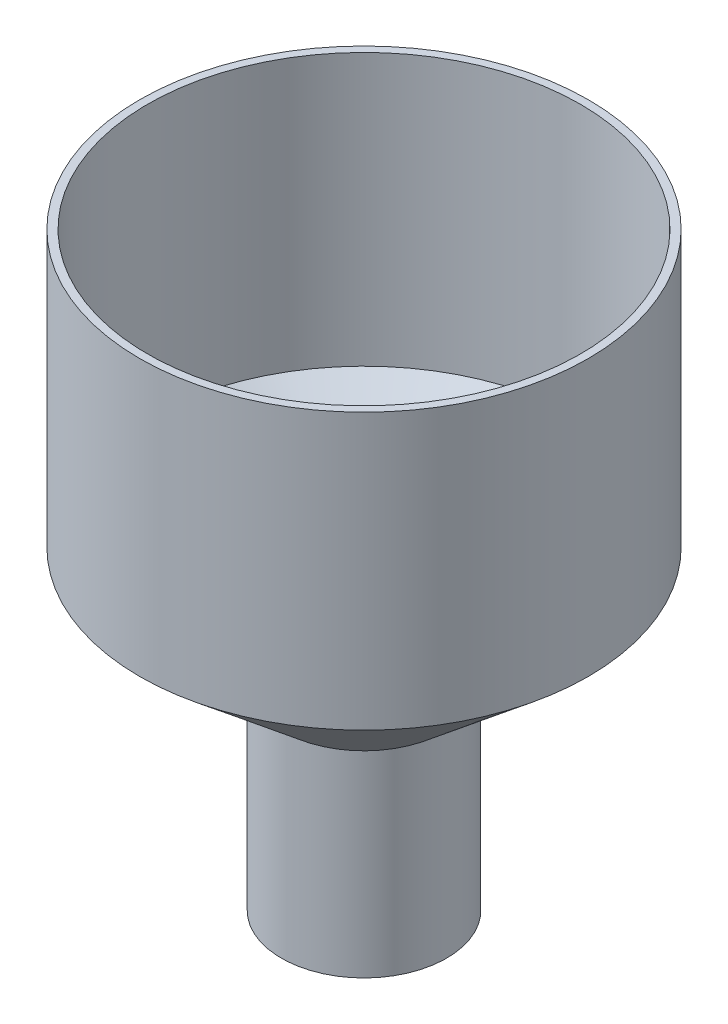
ISO-10303-21;
HEADER;
FILE_DESCRIPTION(('STEP AP214'),'2;1');
FILE_NAME('part.step','',(''),(''),'','','');
FILE_SCHEMA(('AUTOMOTIVE_DESIGN { 1 0 10303 214 1 1 1 1 }'));
ENDSEC;
DATA;
#1=APPLICATION_CONTEXT('core data for automotive mechanical design processes');
#2=APPLICATION_PROTOCOL_DEFINITION('international standard','automotive_design',2000,#1);
#3=PRODUCT_CONTEXT('',#1,'mechanical');
#4=PRODUCT('Part','Part','',(#3));
#5=PRODUCT_RELATED_PRODUCT_CATEGORY('part','',(#4));
#6=PRODUCT_DEFINITION_FORMATION('','',#4);
#7=PRODUCT_DEFINITION_CONTEXT('part definition',#1,'design');
#8=PRODUCT_DEFINITION('design','',#6,#7);
#9=PRODUCT_DEFINITION_SHAPE('','',#8);
#10=(LENGTH_UNIT() NAMED_UNIT(*) SI_UNIT(.MILLI.,.METRE.));
#11=(NAMED_UNIT(*) PLANE_ANGLE_UNIT() SI_UNIT($,.RADIAN.));
#12=(NAMED_UNIT(*) SI_UNIT($,.STERADIAN.) SOLID_ANGLE_UNIT());
#13=UNCERTAINTY_MEASURE_WITH_UNIT(LENGTH_MEASURE(1.E-05),#10,'distance_accuracy_value','');
#14=(GEOMETRIC_REPRESENTATION_CONTEXT(3) GLOBAL_UNCERTAINTY_ASSIGNED_CONTEXT((#13)) GLOBAL_UNIT_ASSIGNED_CONTEXT((#10,
#11,#12)) REPRESENTATION_CONTEXT('',''));
#15=CARTESIAN_POINT('',(0.,0.,0.));
#16=DIRECTION('',(0.,0.,1.));
#17=DIRECTION('',(1.,0.,0.));
#18=AXIS2_PLACEMENT_3D('',#15,#16,#17);
#19=CARTESIAN_POINT('',(21.,-26.6692575745728,0.));
#20=DIRECTION('',(0.,-1.,0.));
#21=DIRECTION('',(0.,0.,-1.));
#22=AXIS2_PLACEMENT_3D('',#19,#20,#21);
#23=PLANE('',#22);
#24=CARTESIAN_POINT('',(0.,-26.6692575745728,0.));
#25=DIRECTION('',(0.,-1.,0.));
#26=DIRECTION('',(0.,0.,-1.));
#27=AXIS2_PLACEMENT_3D('',#24,#25,#26);
#28=CIRCLE('',#27,21.);
#29=CARTESIAN_POINT('',(0.,-26.6692575745728,-21.));
#30=VERTEX_POINT('',#29);
#31=EDGE_CURVE('E71',#30,#30,#28,.T.);
#32=ORIENTED_EDGE('',*,*,#31,.T.);
#33=EDGE_LOOP('',(#32));
#34=FACE_BOUND('',#33,.T.);
#35=CARTESIAN_POINT('',(0.,-26.6692575745728,0.));
#36=DIRECTION('',(0.,-1.,0.));
#37=DIRECTION('',(0.,0.,-1.));
#38=AXIS2_PLACEMENT_3D('',#35,#36,#37);
#39=CIRCLE('',#38,19.);
#40=CARTESIAN_POINT('',(0.,-26.6692575745728,-19.));
#41=VERTEX_POINT('',#40);
#42=EDGE_CURVE('E10',#41,#41,#39,.T.);
#43=ORIENTED_EDGE('',*,*,#42,.F.);
#44=EDGE_LOOP('',(#43));
#45=FACE_BOUND('',#44,.T.);
#46=ADVANCED_FACE('F34',(#34,#45),#23,.T.);
#47=CARTESIAN_POINT('',(0.,0.,0.));
#48=DIRECTION('',(0.,-1.,0.));
#49=DIRECTION('',(0.,0.,-1.));
#50=AXIS2_PLACEMENT_3D('',#47,#48,#49);
#51=CYLINDRICAL_SURFACE('',#50,19.);
#52=ORIENTED_EDGE('',*,*,#42,.T.);
#53=EDGE_LOOP('',(#52));
#54=FACE_BOUND('',#53,.T.);
#55=CARTESIAN_POINT('',(0.,24.267492317396,0.));
#56=DIRECTION('',(0.,-1.,0.));
#57=DIRECTION('',(0.,0.,-1.));
#58=AXIS2_PLACEMENT_3D('',#55,#56,#57);
#59=CIRCLE('',#58,19.);
#60=CARTESIAN_POINT('',(0.,24.267492317396,-19.));
#61=VERTEX_POINT('',#60);
#62=EDGE_CURVE('E41',#61,#61,#59,.T.);
#63=ORIENTED_EDGE('',*,*,#62,.F.);
#64=EDGE_LOOP('',(#63));
#65=FACE_BOUND('',#64,.T.);
#66=ADVANCED_FACE('F91',(#54,#65),#51,.F.);
#67=CARTESIAN_POINT('',(0.,54.267492317396,0.));
#68=DIRECTION('',(0.,1.,0.));
#69=DIRECTION('',(0.,0.,1.));
#70=AXIS2_PLACEMENT_3D('',#67,#68,#69);
#71=CONICAL_SURFACE('',#70,55.,0.876058050598194);
#72=ORIENTED_EDGE('',*,*,#62,.T.);
#73=EDGE_LOOP('',(#72));
#74=FACE_BOUND('',#73,.T.);
#75=CARTESIAN_POINT('',(0.,54.267492317396,0.));
#76=DIRECTION('',(0.,-1.,0.));
#77=DIRECTION('',(0.,0.,-1.));
#78=AXIS2_PLACEMENT_3D('',#75,#76,#77);
#79=CIRCLE('',#78,55.);
#80=CARTESIAN_POINT('',(0.,54.267492317396,-55.));
#81=VERTEX_POINT('',#80);
#82=EDGE_CURVE('E47',#81,#81,#79,.T.);
#83=ORIENTED_EDGE('',*,*,#82,.F.);
#84=EDGE_LOOP('',(#83));
#85=FACE_BOUND('',#84,.T.);
#86=ADVANCED_FACE('F95',(#74,#85),#71,.F.);
#87=CARTESIAN_POINT('',(0.,0.,0.));
#88=DIRECTION('',(0.,-1.,0.));
#89=DIRECTION('',(0.,0.,-1.));
#90=AXIS2_PLACEMENT_3D('',#87,#88,#89);
#91=CYLINDRICAL_SURFACE('',#90,55.);
#92=ORIENTED_EDGE('',*,*,#82,.T.);
#93=EDGE_LOOP('',(#92));
#94=FACE_BOUND('',#93,.T.);
#95=CARTESIAN_POINT('',(0.,123.330742425427,0.));
#96=DIRECTION('',(0.,-1.,0.));
#97=DIRECTION('',(0.,0.,-1.));
#98=AXIS2_PLACEMENT_3D('',#95,#96,#97);
#99=CIRCLE('',#98,55.);
#100=CARTESIAN_POINT('',(0.,123.330742425427,-55.));
#101=VERTEX_POINT('',#100);
#102=EDGE_CURVE('E53',#101,#101,#99,.T.);
#103=ORIENTED_EDGE('',*,*,#102,.F.);
#104=EDGE_LOOP('',(#103));
#105=FACE_BOUND('',#104,.T.);
#106=ADVANCED_FACE('F99',(#94,#105),#91,.F.);
#107=CARTESIAN_POINT('',(55.,123.330742425427,0.));
#108=DIRECTION('',(0.,1.,0.));
#109=DIRECTION('',(0.,0.,1.));
#110=AXIS2_PLACEMENT_3D('',#107,#108,#109);
#111=PLANE('',#110);
#112=ORIENTED_EDGE('',*,*,#102,.T.);
#113=EDGE_LOOP('',(#112));
#114=FACE_BOUND('',#113,.T.);
#115=CARTESIAN_POINT('',(0.,123.330742425427,0.));
#116=DIRECTION('',(0.,-1.,0.));
#117=DIRECTION('',(0.,0.,-1.));
#118=AXIS2_PLACEMENT_3D('',#115,#116,#117);
#119=CIRCLE('',#118,57.);
#120=CARTESIAN_POINT('',(0.,123.330742425427,-57.));
#121=VERTEX_POINT('',#120);
#122=EDGE_CURVE('E59',#121,#121,#119,.T.);
#123=ORIENTED_EDGE('',*,*,#122,.F.);
#124=EDGE_LOOP('',(#123));
#125=FACE_BOUND('',#124,.T.);
#126=ADVANCED_FACE('F105',(#114,#125),#111,.T.);
#127=CARTESIAN_POINT('',(0.,0.,0.));
#128=DIRECTION('',(0.,-1.,0.));
#129=DIRECTION('',(0.,0.,-1.));
#130=AXIS2_PLACEMENT_3D('',#127,#128,#129);
#131=CYLINDRICAL_SURFACE('',#130,57.);
#132=ORIENTED_EDGE('',*,*,#122,.T.);
#133=EDGE_LOOP('',(#132));
#134=FACE_BOUND('',#133,.T.);
#135=CARTESIAN_POINT('',(0.,53.3307424254272,0.));
#136=DIRECTION('',(0.,-1.,0.));
#137=DIRECTION('',(0.,0.,-1.));
#138=AXIS2_PLACEMENT_3D('',#135,#136,#137);
#139=CIRCLE('',#138,57.);
#140=CARTESIAN_POINT('',(0.,53.3307424254272,-57.));
#141=VERTEX_POINT('',#140);
#142=EDGE_CURVE('E63',#141,#141,#139,.T.);
#143=ORIENTED_EDGE('',*,*,#142,.F.);
#144=EDGE_LOOP('',(#143));
#145=FACE_BOUND('',#144,.T.);
#146=ADVANCED_FACE('F87',(#134,#145),#131,.T.);
#147=CARTESIAN_POINT('',(0.,23.3307424254272,0.));
#148=DIRECTION('',(0.,1.,0.));
#149=DIRECTION('',(0.,0.,1.));
#150=AXIS2_PLACEMENT_3D('',#147,#148,#149);
#151=CONICAL_SURFACE('',#150,21.,0.876058050598194);
#152=ORIENTED_EDGE('',*,*,#142,.T.);
#153=EDGE_LOOP('',(#152));
#154=FACE_BOUND('',#153,.T.);
#155=CARTESIAN_POINT('',(0.,23.3307424254272,0.));
#156=DIRECTION('',(0.,-1.,0.));
#157=DIRECTION('',(0.,0.,-1.));
#158=AXIS2_PLACEMENT_3D('',#155,#156,#157);
#159=CIRCLE('',#158,21.);
#160=CARTESIAN_POINT('',(0.,23.3307424254272,-21.));
#161=VERTEX_POINT('',#160);
#162=EDGE_CURVE('E67',#161,#161,#159,.T.);
#163=ORIENTED_EDGE('',*,*,#162,.F.);
#164=EDGE_LOOP('',(#163));
#165=FACE_BOUND('',#164,.T.);
#166=ADVANCED_FACE('F81',(#154,#165),#151,.T.);
#167=CARTESIAN_POINT('',(0.,0.,0.));
#168=DIRECTION('',(0.,-1.,0.));
#169=DIRECTION('',(0.,0.,-1.));
#170=AXIS2_PLACEMENT_3D('',#167,#168,#169);
#171=CYLINDRICAL_SURFACE('',#170,21.);
#172=ORIENTED_EDGE('',*,*,#162,.T.);
#173=EDGE_LOOP('',(#172));
#174=FACE_BOUND('',#173,.T.);
#175=ORIENTED_EDGE('',*,*,#31,.F.);
#176=EDGE_LOOP('',(#175));
#177=FACE_BOUND('',#176,.T.);
#178=ADVANCED_FACE('F79',(#174,#177),#171,.T.);
#179=CLOSED_SHELL('',(#46,#66,#86,#106,#126,#146,#166,#178));
#180=MANIFOLD_SOLID_BREP('B2',#179);
#181=ADVANCED_BREP_SHAPE_REPRESENTATION('',(#18,#180),#14);
#182=SHAPE_DEFINITION_REPRESENTATION(#9,#181);
ENDSEC;
END-ISO-10303-21;
